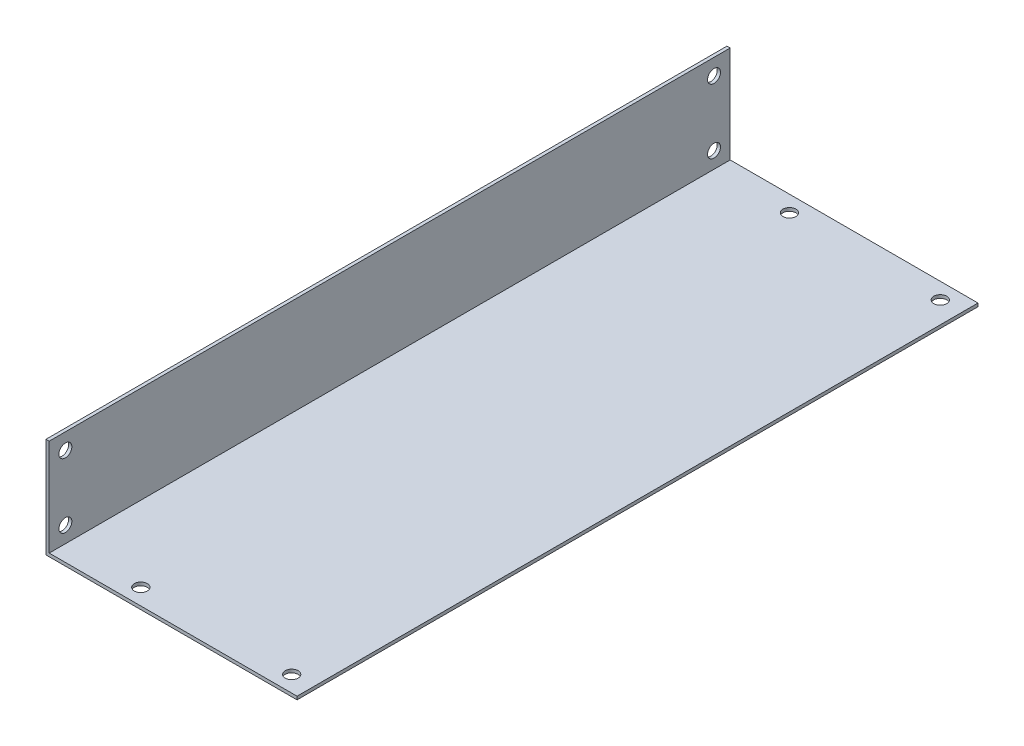
ISO-10303-21;
HEADER;
FILE_DESCRIPTION(('STEP AP214'),'2;1');
FILE_NAME('part.step','',(''),(''),'','','');
FILE_SCHEMA(('AUTOMOTIVE_DESIGN { 1 0 10303 214 1 1 1 1 }'));
ENDSEC;
DATA;
#1=APPLICATION_CONTEXT('core data for automotive mechanical design processes');
#2=APPLICATION_PROTOCOL_DEFINITION('international standard','automotive_design',2000,#1);
#3=PRODUCT_CONTEXT('',#1,'mechanical');
#4=PRODUCT('Part','Part','',(#3));
#5=PRODUCT_RELATED_PRODUCT_CATEGORY('part','',(#4));
#6=PRODUCT_DEFINITION_FORMATION('','',#4);
#7=PRODUCT_DEFINITION_CONTEXT('part definition',#1,'design');
#8=PRODUCT_DEFINITION('design','',#6,#7);
#9=PRODUCT_DEFINITION_SHAPE('','',#8);
#10=(LENGTH_UNIT() NAMED_UNIT(*) SI_UNIT(.MILLI.,.METRE.));
#11=(NAMED_UNIT(*) PLANE_ANGLE_UNIT() SI_UNIT($,.RADIAN.));
#12=(NAMED_UNIT(*) SI_UNIT($,.STERADIAN.) SOLID_ANGLE_UNIT());
#13=UNCERTAINTY_MEASURE_WITH_UNIT(LENGTH_MEASURE(1.E-05),#10,'distance_accuracy_value','');
#14=(GEOMETRIC_REPRESENTATION_CONTEXT(3) GLOBAL_UNCERTAINTY_ASSIGNED_CONTEXT((#13)) GLOBAL_UNIT_ASSIGNED_CONTEXT((#10,
#11,#12)) REPRESENTATION_CONTEXT('',''));
#15=CARTESIAN_POINT('',(0.,0.,0.));
#16=DIRECTION('',(0.,0.,1.));
#17=DIRECTION('',(1.,0.,0.));
#18=AXIS2_PLACEMENT_3D('',#15,#16,#17);
#19=CARTESIAN_POINT('',(1.5,0.,316.));
#20=DIRECTION('',(0.,-1.,0.));
#21=DIRECTION('',(0.,0.,-1.));
#22=AXIS2_PLACEMENT_3D('',#19,#20,#21);
#23=PLANE('',#22);
#24=DIRECTION('',(-1.,0.,0.));
#25=VECTOR('',#24,1.);
#26=CARTESIAN_POINT('',(1.5,0.,0.));
#27=LINE('',#26,#25);
#28=CARTESIAN_POINT('',(1.5,0.,0.));
#29=VERTEX_POINT('',#28);
#30=CARTESIAN_POINT('',(0.,0.,0.));
#31=VERTEX_POINT('',#30);
#32=EDGE_CURVE('E118',#29,#31,#27,.T.);
#33=ORIENTED_EDGE('',*,*,#32,.T.);
#34=DIRECTION('',(0.,0.,-1.));
#35=VECTOR('',#34,1.);
#36=CARTESIAN_POINT('',(0.,0.,316.));
#37=LINE('',#36,#35);
#38=CARTESIAN_POINT('',(0.,0.,316.));
#39=VERTEX_POINT('',#38);
#40=EDGE_CURVE('E11',#39,#31,#37,.T.);
#41=ORIENTED_EDGE('',*,*,#40,.F.);
#42=DIRECTION('',(-1.,0.,0.));
#43=VECTOR('',#42,1.);
#44=CARTESIAN_POINT('',(1.5,0.,316.));
#45=LINE('',#44,#43);
#46=CARTESIAN_POINT('',(1.5,0.,316.));
#47=VERTEX_POINT('',#46);
#48=EDGE_CURVE('E129',#47,#39,#45,.T.);
#49=ORIENTED_EDGE('',*,*,#48,.F.);
#50=DIRECTION('',(0.,0.,-1.));
#51=VECTOR('',#50,1.);
#52=CARTESIAN_POINT('',(1.5,0.,316.));
#53=LINE('',#52,#51);
#54=EDGE_CURVE('E114',#47,#29,#53,.T.);
#55=ORIENTED_EDGE('',*,*,#54,.T.);
#56=EDGE_LOOP('',(#33,#41,#49,#55));
#57=FACE_BOUND('',#56,.T.);
#58=ADVANCED_FACE('F34',(#57),#23,.F.);
#59=CARTESIAN_POINT('',(0.,0.,316.));
#60=DIRECTION('',(1.,0.,0.));
#61=DIRECTION('',(0.,1.,0.));
#62=AXIS2_PLACEMENT_3D('',#59,#60,#61);
#63=PLANE('',#62);
#64=CARTESIAN_POINT('',(0.,-37.5000000000001,7.50000000000017));
#65=DIRECTION('',(-1.,0.,0.));
#66=DIRECTION('',(0.,-1.,0.));
#67=AXIS2_PLACEMENT_3D('',#64,#65,#66);
#68=CIRCLE('',#67,2.99999999999999);
#69=CARTESIAN_POINT('',(0.,-40.5,7.50000000000017));
#70=VERTEX_POINT('',#69);
#71=EDGE_CURVE('E313',#70,#70,#68,.T.);
#72=ORIENTED_EDGE('',*,*,#71,.F.);
#73=EDGE_LOOP('',(#72));
#74=FACE_BOUND('',#73,.T.);
#75=CARTESIAN_POINT('',(0.,-7.50000000000006,7.49999999999995));
#76=DIRECTION('',(-1.,0.,0.));
#77=DIRECTION('',(0.,-1.,0.));
#78=AXIS2_PLACEMENT_3D('',#75,#76,#77);
#79=CIRCLE('',#78,3.);
#80=CARTESIAN_POINT('',(0.,-10.5000000000001,7.49999999999995));
#81=VERTEX_POINT('',#80);
#82=EDGE_CURVE('E312',#81,#81,#79,.T.);
#83=ORIENTED_EDGE('',*,*,#82,.F.);
#84=EDGE_LOOP('',(#83));
#85=FACE_BOUND('',#84,.T.);
#86=CARTESIAN_POINT('',(0.,-7.50000000000005,308.5));
#87=DIRECTION('',(-1.,0.,0.));
#88=DIRECTION('',(0.,1.,0.));
#89=AXIS2_PLACEMENT_3D('',#86,#87,#88);
#90=CIRCLE('',#89,2.99999999999999);
#91=CARTESIAN_POINT('',(0.,-4.50000000000006,308.5));
#92=VERTEX_POINT('',#91);
#93=EDGE_CURVE('E320',#92,#92,#90,.T.);
#94=ORIENTED_EDGE('',*,*,#93,.F.);
#95=EDGE_LOOP('',(#94));
#96=FACE_BOUND('',#95,.T.);
#97=CARTESIAN_POINT('',(0.,-37.5,308.5));
#98=DIRECTION('',(-1.,0.,0.));
#99=DIRECTION('',(0.,1.,0.));
#100=AXIS2_PLACEMENT_3D('',#97,#98,#99);
#101=CIRCLE('',#100,3.00000000000005);
#102=CARTESIAN_POINT('',(0.,-34.5,308.5));
#103=VERTEX_POINT('',#102);
#104=EDGE_CURVE('E299',#103,#103,#101,.T.);
#105=ORIENTED_EDGE('',*,*,#104,.F.);
#106=EDGE_LOOP('',(#105));
#107=FACE_BOUND('',#106,.T.);
#108=DIRECTION('',(0.,-1.,0.));
#109=VECTOR('',#108,1.);
#110=CARTESIAN_POINT('',(0.,0.,0.));
#111=LINE('',#110,#109);
#112=CARTESIAN_POINT('',(0.,-46.5,0.));
#113=VERTEX_POINT('',#112);
#114=EDGE_CURVE('E121',#31,#113,#111,.T.);
#115=ORIENTED_EDGE('',*,*,#114,.T.);
#116=DIRECTION('',(0.,0.,-1.));
#117=VECTOR('',#116,1.);
#118=CARTESIAN_POINT('',(0.,-46.5,316.));
#119=LINE('',#118,#117);
#120=CARTESIAN_POINT('',(0.,-46.5,316.));
#121=VERTEX_POINT('',#120);
#122=EDGE_CURVE('E42',#121,#113,#119,.T.);
#123=ORIENTED_EDGE('',*,*,#122,.F.);
#124=DIRECTION('',(0.,-1.,0.));
#125=VECTOR('',#124,1.);
#126=CARTESIAN_POINT('',(0.,0.,316.));
#127=LINE('',#126,#125);
#128=EDGE_CURVE('E87',#39,#121,#127,.T.);
#129=ORIENTED_EDGE('',*,*,#128,.F.);
#130=ORIENTED_EDGE('',*,*,#40,.T.);
#131=EDGE_LOOP('',(#115,#123,#129,#130));
#132=FACE_BOUND('',#131,.T.);
#133=ADVANCED_FACE('F157',(#74,#85,#96,#107,#132),#63,.F.);
#134=CARTESIAN_POINT('',(0.,-46.5,316.));
#135=DIRECTION('',(0.,1.,0.));
#136=DIRECTION('',(0.,0.,1.));
#137=AXIS2_PLACEMENT_3D('',#134,#135,#136);
#138=PLANE('',#137);
#139=CARTESIAN_POINT('',(36.5,-46.5,308.5));
#140=DIRECTION('',(0.,-1.,0.));
#141=DIRECTION('',(0.,0.,-1.));
#142=AXIS2_PLACEMENT_3D('',#139,#140,#141);
#143=CIRCLE('',#142,3.);
#144=CARTESIAN_POINT('',(36.5,-46.5,305.5));
#145=VERTEX_POINT('',#144);
#146=EDGE_CURVE('E336',#145,#145,#143,.T.);
#147=ORIENTED_EDGE('',*,*,#146,.F.);
#148=EDGE_LOOP('',(#147));
#149=FACE_BOUND('',#148,.T.);
#150=CARTESIAN_POINT('',(106.5,-46.5,7.50000000000001));
#151=DIRECTION('',(0.,-1.,0.));
#152=DIRECTION('',(0.,0.,1.));
#153=AXIS2_PLACEMENT_3D('',#150,#151,#152);
#154=CIRCLE('',#153,3.00000000000001);
#155=CARTESIAN_POINT('',(106.5,-46.5,4.5));
#156=VERTEX_POINT('',#155);
#157=EDGE_CURVE('E337',#156,#156,#154,.T.);
#158=ORIENTED_EDGE('',*,*,#157,.F.);
#159=EDGE_LOOP('',(#158));
#160=FACE_BOUND('',#159,.T.);
#161=CARTESIAN_POINT('',(36.5,-46.5,7.50000000000001));
#162=DIRECTION('',(0.,-1.,0.));
#163=DIRECTION('',(0.,0.,1.));
#164=AXIS2_PLACEMENT_3D('',#161,#162,#163);
#165=CIRCLE('',#164,3.);
#166=CARTESIAN_POINT('',(36.5,-46.5,4.50000000000001));
#167=VERTEX_POINT('',#166);
#168=EDGE_CURVE('E346',#167,#167,#165,.T.);
#169=ORIENTED_EDGE('',*,*,#168,.F.);
#170=EDGE_LOOP('',(#169));
#171=FACE_BOUND('',#170,.T.);
#172=CARTESIAN_POINT('',(106.5,-46.5,308.5));
#173=DIRECTION('',(0.,-1.,0.));
#174=DIRECTION('',(0.,0.,-1.));
#175=AXIS2_PLACEMENT_3D('',#172,#173,#174);
#176=CIRCLE('',#175,3.00000000000001);
#177=CARTESIAN_POINT('',(106.5,-46.5,305.5));
#178=VERTEX_POINT('',#177);
#179=EDGE_CURVE('E329',#178,#178,#176,.T.);
#180=ORIENTED_EDGE('',*,*,#179,.F.);
#181=EDGE_LOOP('',(#180));
#182=FACE_BOUND('',#181,.T.);
#183=DIRECTION('',(1.,0.,0.));
#184=VECTOR('',#183,1.);
#185=CARTESIAN_POINT('',(0.,-46.5,0.));
#186=LINE('',#185,#184);
#187=CARTESIAN_POINT('',(116.5,-46.5,0.));
#188=VERTEX_POINT('',#187);
#189=EDGE_CURVE('E124',#113,#188,#186,.T.);
#190=ORIENTED_EDGE('',*,*,#189,.T.);
#191=DIRECTION('',(0.,0.,-1.));
#192=VECTOR('',#191,1.);
#193=CARTESIAN_POINT('',(116.5,-46.5,316.));
#194=LINE('',#193,#192);
#195=CARTESIAN_POINT('',(116.5,-46.5,316.));
#196=VERTEX_POINT('',#195);
#197=EDGE_CURVE('E109',#196,#188,#194,.T.);
#198=ORIENTED_EDGE('',*,*,#197,.F.);
#199=DIRECTION('',(1.,0.,0.));
#200=VECTOR('',#199,1.);
#201=CARTESIAN_POINT('',(0.,-46.5,316.));
#202=LINE('',#201,#200);
#203=EDGE_CURVE('E100',#121,#196,#202,.T.);
#204=ORIENTED_EDGE('',*,*,#203,.F.);
#205=ORIENTED_EDGE('',*,*,#122,.T.);
#206=EDGE_LOOP('',(#190,#198,#204,#205));
#207=FACE_BOUND('',#206,.T.);
#208=ADVANCED_FACE('F135',(#149,#160,#171,#182,#207),#138,.F.);
#209=CARTESIAN_POINT('',(116.5,-46.5,316.));
#210=DIRECTION('',(-1.,0.,0.));
#211=DIRECTION('',(0.,0.,1.));
#212=AXIS2_PLACEMENT_3D('',#209,#210,#211);
#213=PLANE('',#212);
#214=DIRECTION('',(0.,1.,0.));
#215=VECTOR('',#214,1.);
#216=CARTESIAN_POINT('',(116.5,-46.5,0.));
#217=LINE('',#216,#215);
#218=CARTESIAN_POINT('',(116.5,-45.,0.));
#219=VERTEX_POINT('',#218);
#220=EDGE_CURVE('E108',#188,#219,#217,.T.);
#221=ORIENTED_EDGE('',*,*,#220,.T.);
#222=DIRECTION('',(0.,0.,-1.));
#223=VECTOR('',#222,1.);
#224=CARTESIAN_POINT('',(116.5,-45.,316.));
#225=LINE('',#224,#223);
#226=CARTESIAN_POINT('',(116.5,-45.,316.));
#227=VERTEX_POINT('',#226);
#228=EDGE_CURVE('E105',#227,#219,#225,.T.);
#229=ORIENTED_EDGE('',*,*,#228,.F.);
#230=DIRECTION('',(0.,1.,0.));
#231=VECTOR('',#230,1.);
#232=CARTESIAN_POINT('',(116.5,-46.5,316.));
#233=LINE('',#232,#231);
#234=EDGE_CURVE('E94',#196,#227,#233,.T.);
#235=ORIENTED_EDGE('',*,*,#234,.F.);
#236=ORIENTED_EDGE('',*,*,#197,.T.);
#237=EDGE_LOOP('',(#221,#229,#235,#236));
#238=FACE_BOUND('',#237,.T.);
#239=ADVANCED_FACE('F106',(#238),#213,.F.);
#240=CARTESIAN_POINT('',(116.5,-45.,316.));
#241=DIRECTION('',(0.,-1.,0.));
#242=DIRECTION('',(1.,0.,0.));
#243=AXIS2_PLACEMENT_3D('',#240,#241,#242);
#244=PLANE('',#243);
#245=CARTESIAN_POINT('',(36.5,-45.,308.5));
#246=DIRECTION('',(0.,-1.,0.));
#247=DIRECTION('',(1.,0.,0.));
#248=AXIS2_PLACEMENT_3D('',#245,#246,#247);
#249=CIRCLE('',#248,3.);
#250=CARTESIAN_POINT('',(36.5,-45.,305.5));
#251=VERTEX_POINT('',#250);
#252=EDGE_CURVE('E332',#251,#251,#249,.F.);
#253=ORIENTED_EDGE('',*,*,#252,.F.);
#254=EDGE_LOOP('',(#253));
#255=FACE_BOUND('',#254,.T.);
#256=CARTESIAN_POINT('',(106.5,-45.,7.50000000000001));
#257=DIRECTION('',(0.,-1.,0.));
#258=DIRECTION('',(1.,0.,0.));
#259=AXIS2_PLACEMENT_3D('',#256,#257,#258);
#260=CIRCLE('',#259,3.00000000000001);
#261=CARTESIAN_POINT('',(106.5,-45.,4.5));
#262=VERTEX_POINT('',#261);
#263=EDGE_CURVE('E333',#262,#262,#260,.F.);
#264=ORIENTED_EDGE('',*,*,#263,.F.);
#265=EDGE_LOOP('',(#264));
#266=FACE_BOUND('',#265,.T.);
#267=CARTESIAN_POINT('',(36.5,-45.,7.50000000000001));
#268=DIRECTION('',(0.,-1.,0.));
#269=DIRECTION('',(1.,0.,0.));
#270=AXIS2_PLACEMENT_3D('',#267,#268,#269);
#271=CIRCLE('',#270,3.);
#272=CARTESIAN_POINT('',(36.5,-45.,4.50000000000001));
#273=VERTEX_POINT('',#272);
#274=EDGE_CURVE('E340',#273,#273,#271,.F.);
#275=ORIENTED_EDGE('',*,*,#274,.F.);
#276=EDGE_LOOP('',(#275));
#277=FACE_BOUND('',#276,.T.);
#278=CARTESIAN_POINT('',(106.5,-45.,308.5));
#279=DIRECTION('',(0.,-1.,0.));
#280=DIRECTION('',(1.,0.,0.));
#281=AXIS2_PLACEMENT_3D('',#278,#279,#280);
#282=CIRCLE('',#281,3.00000000000001);
#283=CARTESIAN_POINT('',(106.5,-45.,305.5));
#284=VERTEX_POINT('',#283);
#285=EDGE_CURVE('E316',#284,#284,#282,.F.);
#286=ORIENTED_EDGE('',*,*,#285,.F.);
#287=EDGE_LOOP('',(#286));
#288=FACE_BOUND('',#287,.T.);
#289=DIRECTION('',(-1.,0.,0.));
#290=VECTOR('',#289,1.);
#291=CARTESIAN_POINT('',(116.5,-45.,0.));
#292=LINE('',#291,#290);
#293=CARTESIAN_POINT('',(1.5,-45.,0.));
#294=VERTEX_POINT('',#293);
#295=EDGE_CURVE('E73',#219,#294,#292,.T.);
#296=ORIENTED_EDGE('',*,*,#295,.T.);
#297=DIRECTION('',(0.,0.,-1.));
#298=VECTOR('',#297,1.);
#299=CARTESIAN_POINT('',(1.5,-45.,316.));
#300=LINE('',#299,#298);
#301=CARTESIAN_POINT('',(1.5,-45.,316.));
#302=VERTEX_POINT('',#301);
#303=EDGE_CURVE('E110',#302,#294,#300,.T.);
#304=ORIENTED_EDGE('',*,*,#303,.F.);
#305=DIRECTION('',(-1.,0.,0.));
#306=VECTOR('',#305,1.);
#307=CARTESIAN_POINT('',(116.5,-45.,316.));
#308=LINE('',#307,#306);
#309=EDGE_CURVE('E98',#227,#302,#308,.T.);
#310=ORIENTED_EDGE('',*,*,#309,.F.);
#311=ORIENTED_EDGE('',*,*,#228,.T.);
#312=EDGE_LOOP('',(#296,#304,#310,#311));
#313=FACE_BOUND('',#312,.T.);
#314=ADVANCED_FACE('F112',(#255,#266,#277,#288,#313),#244,.F.);
#315=CARTESIAN_POINT('',(1.5,-45.,316.));
#316=DIRECTION('',(-1.,0.,0.));
#317=DIRECTION('',(0.,-1.,0.));
#318=AXIS2_PLACEMENT_3D('',#315,#316,#317);
#319=PLANE('',#318);
#320=CARTESIAN_POINT('',(1.5,-37.5000000000001,7.50000000000017));
#321=DIRECTION('',(-1.,0.,0.));
#322=DIRECTION('',(0.,-1.,0.));
#323=AXIS2_PLACEMENT_3D('',#320,#321,#322);
#324=CIRCLE('',#323,2.99999999999999);
#325=CARTESIAN_POINT('',(1.5,-40.5,7.50000000000017));
#326=VERTEX_POINT('',#325);
#327=EDGE_CURVE('E309',#326,#326,#324,.F.);
#328=ORIENTED_EDGE('',*,*,#327,.F.);
#329=EDGE_LOOP('',(#328));
#330=FACE_BOUND('',#329,.T.);
#331=CARTESIAN_POINT('',(1.5,-7.50000000000006,7.49999999999995));
#332=DIRECTION('',(-1.,0.,0.));
#333=DIRECTION('',(0.,-1.,0.));
#334=AXIS2_PLACEMENT_3D('',#331,#332,#333);
#335=CIRCLE('',#334,3.);
#336=CARTESIAN_POINT('',(1.5,-10.5000000000001,7.49999999999995));
#337=VERTEX_POINT('',#336);
#338=EDGE_CURVE('E317',#337,#337,#335,.F.);
#339=ORIENTED_EDGE('',*,*,#338,.F.);
#340=EDGE_LOOP('',(#339));
#341=FACE_BOUND('',#340,.T.);
#342=CARTESIAN_POINT('',(1.5,-7.50000000000005,308.5));
#343=DIRECTION('',(-1.,0.,0.));
#344=DIRECTION('',(0.,-1.,0.));
#345=AXIS2_PLACEMENT_3D('',#342,#343,#344);
#346=CIRCLE('',#345,2.99999999999999);
#347=CARTESIAN_POINT('',(1.5,-10.5,308.5));
#348=VERTEX_POINT('',#347);
#349=EDGE_CURVE('E304',#348,#348,#346,.F.);
#350=ORIENTED_EDGE('',*,*,#349,.F.);
#351=EDGE_LOOP('',(#350));
#352=FACE_BOUND('',#351,.T.);
#353=CARTESIAN_POINT('',(1.5,-37.5,308.5));
#354=DIRECTION('',(-1.,0.,0.));
#355=DIRECTION('',(0.,-1.,0.));
#356=AXIS2_PLACEMENT_3D('',#353,#354,#355);
#357=CIRCLE('',#356,3.00000000000005);
#358=CARTESIAN_POINT('',(1.5,-40.5000000000001,308.5));
#359=VERTEX_POINT('',#358);
#360=EDGE_CURVE('E122',#359,#359,#357,.F.);
#361=ORIENTED_EDGE('',*,*,#360,.F.);
#362=EDGE_LOOP('',(#361));
#363=FACE_BOUND('',#362,.T.);
#364=DIRECTION('',(0.,1.,0.));
#365=VECTOR('',#364,1.);
#366=CARTESIAN_POINT('',(1.5,-45.,0.));
#367=LINE('',#366,#365);
#368=EDGE_CURVE('E79',#294,#29,#367,.T.);
#369=ORIENTED_EDGE('',*,*,#368,.T.);
#370=ORIENTED_EDGE('',*,*,#54,.F.);
#371=DIRECTION('',(0.,1.,0.));
#372=VECTOR('',#371,1.);
#373=CARTESIAN_POINT('',(1.5,-45.,316.));
#374=LINE('',#373,#372);
#375=EDGE_CURVE('E50',#302,#47,#374,.T.);
#376=ORIENTED_EDGE('',*,*,#375,.F.);
#377=ORIENTED_EDGE('',*,*,#303,.T.);
#378=EDGE_LOOP('',(#369,#370,#376,#377));
#379=FACE_BOUND('',#378,.T.);
#380=ADVANCED_FACE('F142',(#330,#341,#352,#363,#379),#319,.F.);
#381=CARTESIAN_POINT('',(0.,0.,316.));
#382=DIRECTION('',(0.,0.,1.));
#383=DIRECTION('',(1.,0.,0.));
#384=AXIS2_PLACEMENT_3D('',#381,#382,#383);
#385=PLANE('',#384);
#386=ORIENTED_EDGE('',*,*,#48,.T.);
#387=ORIENTED_EDGE('',*,*,#128,.T.);
#388=ORIENTED_EDGE('',*,*,#203,.T.);
#389=ORIENTED_EDGE('',*,*,#234,.T.);
#390=ORIENTED_EDGE('',*,*,#309,.T.);
#391=ORIENTED_EDGE('',*,*,#375,.T.);
#392=EDGE_LOOP('',(#386,#387,#388,#389,#390,#391));
#393=FACE_BOUND('',#392,.T.);
#394=ADVANCED_FACE('F96',(#393),#385,.T.);
#395=CARTESIAN_POINT('',(0.,0.,0.));
#396=DIRECTION('',(0.,0.,1.));
#397=DIRECTION('',(1.,0.,0.));
#398=AXIS2_PLACEMENT_3D('',#395,#396,#397);
#399=PLANE('',#398);
#400=ORIENTED_EDGE('',*,*,#32,.F.);
#401=ORIENTED_EDGE('',*,*,#368,.F.);
#402=ORIENTED_EDGE('',*,*,#295,.F.);
#403=ORIENTED_EDGE('',*,*,#220,.F.);
#404=ORIENTED_EDGE('',*,*,#189,.F.);
#405=ORIENTED_EDGE('',*,*,#114,.F.);
#406=EDGE_LOOP('',(#400,#401,#402,#403,#404,#405));
#407=FACE_BOUND('',#406,.T.);
#408=ADVANCED_FACE('F138',(#407),#399,.F.);
#409=CARTESIAN_POINT('',(116.501,-37.5,308.5));
#410=DIRECTION('',(-1.,0.,0.));
#411=DIRECTION('',(0.,-1.,0.));
#412=AXIS2_PLACEMENT_3D('',#409,#410,#411);
#413=CYLINDRICAL_SURFACE('',#412,3.00000000000005);
#414=ORIENTED_EDGE('',*,*,#104,.T.);
#415=EDGE_LOOP('',(#414));
#416=FACE_BOUND('',#415,.T.);
#417=ORIENTED_EDGE('',*,*,#360,.T.);
#418=EDGE_LOOP('',(#417));
#419=FACE_BOUND('',#418,.T.);
#420=ADVANCED_FACE('F238',(#416,#419),#413,.F.);
#421=CARTESIAN_POINT('',(116.501,-7.50000000000004,308.5));
#422=DIRECTION('',(-1.,0.,0.));
#423=DIRECTION('',(0.,-1.,0.));
#424=AXIS2_PLACEMENT_3D('',#421,#422,#423);
#425=CYLINDRICAL_SURFACE('',#424,2.99999999999999);
#426=ORIENTED_EDGE('',*,*,#93,.T.);
#427=EDGE_LOOP('',(#426));
#428=FACE_BOUND('',#427,.T.);
#429=ORIENTED_EDGE('',*,*,#349,.T.);
#430=EDGE_LOOP('',(#429));
#431=FACE_BOUND('',#430,.T.);
#432=ADVANCED_FACE('F234',(#428,#431),#425,.F.);
#433=CARTESIAN_POINT('',(116.501,-7.50000000000004,7.49999999999995));
#434=DIRECTION('',(-1.,0.,0.));
#435=DIRECTION('',(0.,-1.,0.));
#436=AXIS2_PLACEMENT_3D('',#433,#434,#435);
#437=CYLINDRICAL_SURFACE('',#436,3.);
#438=ORIENTED_EDGE('',*,*,#82,.T.);
#439=EDGE_LOOP('',(#438));
#440=FACE_BOUND('',#439,.T.);
#441=ORIENTED_EDGE('',*,*,#338,.T.);
#442=EDGE_LOOP('',(#441));
#443=FACE_BOUND('',#442,.T.);
#444=ADVANCED_FACE('F237',(#440,#443),#437,.F.);
#445=CARTESIAN_POINT('',(116.501,-37.5,7.50000000000017));
#446=DIRECTION('',(-1.,0.,0.));
#447=DIRECTION('',(0.,-1.,0.));
#448=AXIS2_PLACEMENT_3D('',#445,#446,#447);
#449=CYLINDRICAL_SURFACE('',#448,2.99999999999999);
#450=ORIENTED_EDGE('',*,*,#71,.T.);
#451=EDGE_LOOP('',(#450));
#452=FACE_BOUND('',#451,.T.);
#453=ORIENTED_EDGE('',*,*,#327,.T.);
#454=EDGE_LOOP('',(#453));
#455=FACE_BOUND('',#454,.T.);
#456=ADVANCED_FACE('F195',(#452,#455),#449,.F.);
#457=CARTESIAN_POINT('',(106.5,0.001000000000001,308.5));
#458=DIRECTION('',(0.,-1.,0.));
#459=DIRECTION('',(0.,0.,-1.));
#460=AXIS2_PLACEMENT_3D('',#457,#458,#459);
#461=CYLINDRICAL_SURFACE('',#460,3.00000000000001);
#462=CARTESIAN_POINT('',(106.5,-46.5,305.5));
#463=CARTESIAN_POINT('',(106.5,-46.484375,305.5));
#464=CARTESIAN_POINT('',(106.5,-46.46875,305.5));
#465=CARTESIAN_POINT('',(106.5,-46.4375,305.5));
#466=CARTESIAN_POINT('',(106.5,-46.421875,305.5));
#467=CARTESIAN_POINT('',(106.5,-46.390625,305.5));
#468=CARTESIAN_POINT('',(106.5,-46.375,305.5));
#469=CARTESIAN_POINT('',(106.5,-46.34375,305.5));
#470=CARTESIAN_POINT('',(106.5,-46.328125,305.5));
#471=CARTESIAN_POINT('',(106.5,-46.296875,305.5));
#472=CARTESIAN_POINT('',(106.5,-46.28125,305.5));
#473=CARTESIAN_POINT('',(106.5,-46.25,305.5));
#474=CARTESIAN_POINT('',(106.5,-46.234375,305.5));
#475=CARTESIAN_POINT('',(106.5,-46.203125,305.5));
#476=CARTESIAN_POINT('',(106.5,-46.1875,305.5));
#477=CARTESIAN_POINT('',(106.5,-46.15625,305.5));
#478=CARTESIAN_POINT('',(106.5,-46.140625,305.5));
#479=CARTESIAN_POINT('',(106.5,-46.109375,305.5));
#480=CARTESIAN_POINT('',(106.5,-46.09375,305.5));
#481=CARTESIAN_POINT('',(106.5,-46.0625,305.5));
#482=CARTESIAN_POINT('',(106.5,-46.046875,305.5));
#483=CARTESIAN_POINT('',(106.5,-46.015625,305.5));
#484=CARTESIAN_POINT('',(106.5,-46.,305.5));
#485=CARTESIAN_POINT('',(106.5,-45.96875,305.5));
#486=CARTESIAN_POINT('',(106.5,-45.953125,305.5));
#487=CARTESIAN_POINT('',(106.5,-45.921875,305.5));
#488=CARTESIAN_POINT('',(106.5,-45.90625,305.5));
#489=CARTESIAN_POINT('',(106.5,-45.875,305.5));
#490=CARTESIAN_POINT('',(106.5,-45.859375,305.5));
#491=CARTESIAN_POINT('',(106.5,-45.828125,305.5));
#492=CARTESIAN_POINT('',(106.5,-45.8125,305.5));
#493=CARTESIAN_POINT('',(106.5,-45.78125,305.5));
#494=CARTESIAN_POINT('',(106.5,-45.765625,305.5));
#495=CARTESIAN_POINT('',(106.5,-45.734375,305.5));
#496=CARTESIAN_POINT('',(106.5,-45.71875,305.5));
#497=CARTESIAN_POINT('',(106.5,-45.6875,305.5));
#498=CARTESIAN_POINT('',(106.5,-45.671875,305.5));
#499=CARTESIAN_POINT('',(106.5,-45.640625,305.5));
#500=CARTESIAN_POINT('',(106.5,-45.625,305.5));
#501=CARTESIAN_POINT('',(106.5,-45.59375,305.5));
#502=CARTESIAN_POINT('',(106.5,-45.578125,305.5));
#503=CARTESIAN_POINT('',(106.5,-45.546875,305.5));
#504=CARTESIAN_POINT('',(106.5,-45.53125,305.5));
#505=CARTESIAN_POINT('',(106.5,-45.5,305.5));
#506=CARTESIAN_POINT('',(106.5,-45.484375,305.5));
#507=CARTESIAN_POINT('',(106.5,-45.453125,305.5));
#508=CARTESIAN_POINT('',(106.5,-45.4375,305.5));
#509=CARTESIAN_POINT('',(106.5,-45.40625,305.5));
#510=CARTESIAN_POINT('',(106.5,-45.390625,305.5));
#511=CARTESIAN_POINT('',(106.5,-45.359375,305.5));
#512=CARTESIAN_POINT('',(106.5,-45.34375,305.5));
#513=CARTESIAN_POINT('',(106.5,-45.3125,305.5));
#514=CARTESIAN_POINT('',(106.5,-45.296875,305.5));
#515=CARTESIAN_POINT('',(106.5,-45.265625,305.5));
#516=CARTESIAN_POINT('',(106.5,-45.25,305.5));
#517=CARTESIAN_POINT('',(106.5,-45.21875,305.5));
#518=CARTESIAN_POINT('',(106.5,-45.203125,305.5));
#519=CARTESIAN_POINT('',(106.5,-45.171875,305.5));
#520=CARTESIAN_POINT('',(106.5,-45.15625,305.5));
#521=CARTESIAN_POINT('',(106.5,-45.125,305.5));
#522=CARTESIAN_POINT('',(106.5,-45.109375,305.5));
#523=CARTESIAN_POINT('',(106.5,-45.078125,305.5));
#524=CARTESIAN_POINT('',(106.5,-45.0625,305.5));
#525=CARTESIAN_POINT('',(106.5,-45.03125,305.5));
#526=CARTESIAN_POINT('',(106.5,-45.015625,305.5));
#527=CARTESIAN_POINT('',(106.5,-45.,305.5));
#528=B_SPLINE_CURVE_WITH_KNOTS('',3,(#462,#463,#464,#465,#466,#467,#468,#469,#470,#471,#472,
#473,#474,#475,#476,#477,#478,#479,#480,#481,#482,#483,#484,#485,#486,#487,#488,#489,#490,#491,
#492,#493,#494,#495,#496,#497,#498,#499,#500,#501,#502,#503,#504,#505,#506,#507,#508,#509,#510,
#511,#512,#513,#514,#515,#516,#517,#518,#519,#520,#521,#522,#523,#524,#525,#526,#527),
.UNSPECIFIED.,.F.,.F.,(4,2,2,2,2,2,2,2,2,2,2,2,2,2,2,2,2,2,2,2,2,2,2,2,2,2,2,2,2,2,2,2,4),(0.,
0.0468750000000018,0.0937500000000036,0.140624999999998,0.1875,0.234375000000002,
0.281249999999997,0.328124999999999,0.375,0.421875000000002,0.468750000000004,0.515624999999999,
0.5625,0.609375000000002,0.656249999999997,0.703124999999999,0.750000000000001,
0.796875000000002,0.843750000000004,0.890624999999999,0.937500000000001,0.984375000000003,
1.03125,1.078125,1.125,1.171875,1.21875,1.265625,1.3125,1.359375,1.40625,1.453125,1.5),.UNSPECIFIED.);
#529=EDGE_CURVE('BSEAM189',#178,#284,#528,.T.);
#530=ORIENTED_EDGE('',*,*,#179,.T.);
#531=ORIENTED_EDGE('',*,*,#285,.T.);
#532=ORIENTED_EDGE('',*,*,#529,.T.);
#533=ORIENTED_EDGE('',*,*,#529,.F.);
#534=EDGE_LOOP('',(#530,#532,#531,#533));
#535=FACE_BOUND('',#534,.T.);
#536=ADVANCED_FACE('F189',(#535),#461,.F.);
#537=CARTESIAN_POINT('',(36.5,0.001000000000001,7.50000000000001));
#538=DIRECTION('',(0.,-1.,0.));
#539=DIRECTION('',(0.,0.,-1.));
#540=AXIS2_PLACEMENT_3D('',#537,#538,#539);
#541=CYLINDRICAL_SURFACE('',#540,3.);
#542=CARTESIAN_POINT('',(36.5,-46.5,4.50000000000001));
#543=CARTESIAN_POINT('',(36.5,-46.484375,4.50000000000001));
#544=CARTESIAN_POINT('',(36.5,-46.46875,4.50000000000001));
#545=CARTESIAN_POINT('',(36.5,-46.4375,4.50000000000001));
#546=CARTESIAN_POINT('',(36.5,-46.421875,4.50000000000001));
#547=CARTESIAN_POINT('',(36.5,-46.390625,4.50000000000001));
#548=CARTESIAN_POINT('',(36.5,-46.375,4.50000000000001));
#549=CARTESIAN_POINT('',(36.5,-46.34375,4.50000000000001));
#550=CARTESIAN_POINT('',(36.5,-46.328125,4.50000000000001));
#551=CARTESIAN_POINT('',(36.5,-46.296875,4.50000000000001));
#552=CARTESIAN_POINT('',(36.5,-46.28125,4.50000000000001));
#553=CARTESIAN_POINT('',(36.5,-46.25,4.50000000000001));
#554=CARTESIAN_POINT('',(36.5,-46.234375,4.50000000000001));
#555=CARTESIAN_POINT('',(36.5,-46.203125,4.50000000000001));
#556=CARTESIAN_POINT('',(36.5,-46.1875,4.50000000000001));
#557=CARTESIAN_POINT('',(36.5,-46.15625,4.50000000000001));
#558=CARTESIAN_POINT('',(36.5,-46.140625,4.50000000000001));
#559=CARTESIAN_POINT('',(36.5,-46.109375,4.50000000000001));
#560=CARTESIAN_POINT('',(36.5,-46.09375,4.50000000000001));
#561=CARTESIAN_POINT('',(36.5,-46.0625,4.50000000000001));
#562=CARTESIAN_POINT('',(36.5,-46.046875,4.50000000000001));
#563=CARTESIAN_POINT('',(36.5,-46.015625,4.50000000000001));
#564=CARTESIAN_POINT('',(36.5,-46.,4.50000000000001));
#565=CARTESIAN_POINT('',(36.5,-45.96875,4.50000000000001));
#566=CARTESIAN_POINT('',(36.5,-45.953125,4.50000000000001));
#567=CARTESIAN_POINT('',(36.5,-45.921875,4.50000000000001));
#568=CARTESIAN_POINT('',(36.5,-45.90625,4.50000000000001));
#569=CARTESIAN_POINT('',(36.5,-45.875,4.50000000000001));
#570=CARTESIAN_POINT('',(36.5,-45.859375,4.50000000000001));
#571=CARTESIAN_POINT('',(36.5,-45.828125,4.50000000000001));
#572=CARTESIAN_POINT('',(36.5,-45.8125,4.50000000000001));
#573=CARTESIAN_POINT('',(36.5,-45.78125,4.50000000000001));
#574=CARTESIAN_POINT('',(36.5,-45.765625,4.50000000000001));
#575=CARTESIAN_POINT('',(36.5,-45.734375,4.50000000000001));
#576=CARTESIAN_POINT('',(36.5,-45.71875,4.50000000000001));
#577=CARTESIAN_POINT('',(36.5,-45.6875,4.50000000000001));
#578=CARTESIAN_POINT('',(36.5,-45.671875,4.50000000000001));
#579=CARTESIAN_POINT('',(36.5,-45.640625,4.50000000000001));
#580=CARTESIAN_POINT('',(36.5,-45.625,4.50000000000001));
#581=CARTESIAN_POINT('',(36.5,-45.59375,4.50000000000001));
#582=CARTESIAN_POINT('',(36.5,-45.578125,4.50000000000001));
#583=CARTESIAN_POINT('',(36.5,-45.546875,4.50000000000001));
#584=CARTESIAN_POINT('',(36.5,-45.53125,4.50000000000001));
#585=CARTESIAN_POINT('',(36.5,-45.5,4.50000000000001));
#586=CARTESIAN_POINT('',(36.5,-45.484375,4.50000000000001));
#587=CARTESIAN_POINT('',(36.5,-45.453125,4.50000000000001));
#588=CARTESIAN_POINT('',(36.5,-45.4375,4.50000000000001));
#589=CARTESIAN_POINT('',(36.5,-45.40625,4.50000000000001));
#590=CARTESIAN_POINT('',(36.5,-45.390625,4.50000000000001));
#591=CARTESIAN_POINT('',(36.5,-45.359375,4.50000000000001));
#592=CARTESIAN_POINT('',(36.5,-45.34375,4.50000000000001));
#593=CARTESIAN_POINT('',(36.5,-45.3125,4.50000000000001));
#594=CARTESIAN_POINT('',(36.5,-45.296875,4.50000000000001));
#595=CARTESIAN_POINT('',(36.5,-45.265625,4.50000000000001));
#596=CARTESIAN_POINT('',(36.5,-45.25,4.50000000000001));
#597=CARTESIAN_POINT('',(36.5,-45.21875,4.50000000000001));
#598=CARTESIAN_POINT('',(36.5,-45.203125,4.50000000000001));
#599=CARTESIAN_POINT('',(36.5,-45.171875,4.50000000000001));
#600=CARTESIAN_POINT('',(36.5,-45.15625,4.50000000000001));
#601=CARTESIAN_POINT('',(36.5,-45.125,4.50000000000001));
#602=CARTESIAN_POINT('',(36.5,-45.109375,4.50000000000001));
#603=CARTESIAN_POINT('',(36.5,-45.078125,4.50000000000001));
#604=CARTESIAN_POINT('',(36.5,-45.0625,4.50000000000001));
#605=CARTESIAN_POINT('',(36.5,-45.03125,4.50000000000001));
#606=CARTESIAN_POINT('',(36.5,-45.015625,4.50000000000001));
#607=CARTESIAN_POINT('',(36.5,-45.,4.50000000000001));
#608=B_SPLINE_CURVE_WITH_KNOTS('',3,(#542,#543,#544,#545,#546,#547,#548,#549,#550,#551,#552,
#553,#554,#555,#556,#557,#558,#559,#560,#561,#562,#563,#564,#565,#566,#567,#568,#569,#570,#571,
#572,#573,#574,#575,#576,#577,#578,#579,#580,#581,#582,#583,#584,#585,#586,#587,#588,#589,#590,
#591,#592,#593,#594,#595,#596,#597,#598,#599,#600,#601,#602,#603,#604,#605,#606,#607),
.UNSPECIFIED.,.F.,.F.,(4,2,2,2,2,2,2,2,2,2,2,2,2,2,2,2,2,2,2,2,2,2,2,2,2,2,2,2,2,2,2,2,4),(0.,
0.0468750000000018,0.0937499999999966,0.140624999999998,0.1875,0.234374999999995,
0.281249999999997,0.328124999999999,0.375,0.421874999999995,0.468749999999997,0.515624999999999,
0.562499999999994,0.609374999999995,0.656249999999997,0.703124999999992,0.749999999999994,
0.796874999999996,0.84374999999999,0.890624999999992,0.937499999999994,0.984374999999989,
1.03124999999999,1.07812499999999,1.12499999999999,1.17187499999999,1.21874999999999,
1.26562499999999,1.31249999999999,1.35937499999999,1.40624999999999,1.45312499999999,
1.49999999999999),.UNSPECIFIED.);
#609=EDGE_CURVE('BSEAM194',#167,#273,#608,.T.);
#610=ORIENTED_EDGE('',*,*,#168,.T.);
#611=ORIENTED_EDGE('',*,*,#274,.T.);
#612=ORIENTED_EDGE('',*,*,#609,.T.);
#613=ORIENTED_EDGE('',*,*,#609,.F.);
#614=EDGE_LOOP('',(#610,#612,#611,#613));
#615=FACE_BOUND('',#614,.T.);
#616=ADVANCED_FACE('F194',(#615),#541,.F.);
#617=CARTESIAN_POINT('',(106.5,0.001000000000001,7.50000000000001));
#618=DIRECTION('',(0.,-1.,0.));
#619=DIRECTION('',(0.,0.,-1.));
#620=AXIS2_PLACEMENT_3D('',#617,#618,#619);
#621=CYLINDRICAL_SURFACE('',#620,3.00000000000001);
#622=CARTESIAN_POINT('',(106.5,-46.5,4.5));
#623=CARTESIAN_POINT('',(106.5,-46.484375,4.5));
#624=CARTESIAN_POINT('',(106.5,-46.46875,4.5));
#625=CARTESIAN_POINT('',(106.5,-46.4375,4.5));
#626=CARTESIAN_POINT('',(106.5,-46.421875,4.5));
#627=CARTESIAN_POINT('',(106.5,-46.390625,4.5));
#628=CARTESIAN_POINT('',(106.5,-46.375,4.5));
#629=CARTESIAN_POINT('',(106.5,-46.34375,4.5));
#630=CARTESIAN_POINT('',(106.5,-46.328125,4.5));
#631=CARTESIAN_POINT('',(106.5,-46.296875,4.5));
#632=CARTESIAN_POINT('',(106.5,-46.28125,4.5));
#633=CARTESIAN_POINT('',(106.5,-46.25,4.5));
#634=CARTESIAN_POINT('',(106.5,-46.234375,4.5));
#635=CARTESIAN_POINT('',(106.5,-46.203125,4.5));
#636=CARTESIAN_POINT('',(106.5,-46.1875,4.5));
#637=CARTESIAN_POINT('',(106.5,-46.15625,4.5));
#638=CARTESIAN_POINT('',(106.5,-46.140625,4.5));
#639=CARTESIAN_POINT('',(106.5,-46.109375,4.5));
#640=CARTESIAN_POINT('',(106.5,-46.09375,4.5));
#641=CARTESIAN_POINT('',(106.5,-46.0625,4.5));
#642=CARTESIAN_POINT('',(106.5,-46.046875,4.5));
#643=CARTESIAN_POINT('',(106.5,-46.015625,4.5));
#644=CARTESIAN_POINT('',(106.5,-46.,4.5));
#645=CARTESIAN_POINT('',(106.5,-45.96875,4.5));
#646=CARTESIAN_POINT('',(106.5,-45.953125,4.5));
#647=CARTESIAN_POINT('',(106.5,-45.921875,4.5));
#648=CARTESIAN_POINT('',(106.5,-45.90625,4.5));
#649=CARTESIAN_POINT('',(106.5,-45.875,4.5));
#650=CARTESIAN_POINT('',(106.5,-45.859375,4.5));
#651=CARTESIAN_POINT('',(106.5,-45.828125,4.5));
#652=CARTESIAN_POINT('',(106.5,-45.8125,4.5));
#653=CARTESIAN_POINT('',(106.5,-45.78125,4.5));
#654=CARTESIAN_POINT('',(106.5,-45.765625,4.5));
#655=CARTESIAN_POINT('',(106.5,-45.734375,4.5));
#656=CARTESIAN_POINT('',(106.5,-45.71875,4.5));
#657=CARTESIAN_POINT('',(106.5,-45.6875,4.5));
#658=CARTESIAN_POINT('',(106.5,-45.671875,4.5));
#659=CARTESIAN_POINT('',(106.5,-45.640625,4.5));
#660=CARTESIAN_POINT('',(106.5,-45.625,4.5));
#661=CARTESIAN_POINT('',(106.5,-45.59375,4.5));
#662=CARTESIAN_POINT('',(106.5,-45.578125,4.5));
#663=CARTESIAN_POINT('',(106.5,-45.546875,4.5));
#664=CARTESIAN_POINT('',(106.5,-45.53125,4.5));
#665=CARTESIAN_POINT('',(106.5,-45.5,4.5));
#666=CARTESIAN_POINT('',(106.5,-45.484375,4.5));
#667=CARTESIAN_POINT('',(106.5,-45.453125,4.5));
#668=CARTESIAN_POINT('',(106.5,-45.4375,4.5));
#669=CARTESIAN_POINT('',(106.5,-45.40625,4.5));
#670=CARTESIAN_POINT('',(106.5,-45.390625,4.5));
#671=CARTESIAN_POINT('',(106.5,-45.359375,4.5));
#672=CARTESIAN_POINT('',(106.5,-45.34375,4.5));
#673=CARTESIAN_POINT('',(106.5,-45.3125,4.5));
#674=CARTESIAN_POINT('',(106.5,-45.296875,4.5));
#675=CARTESIAN_POINT('',(106.5,-45.265625,4.5));
#676=CARTESIAN_POINT('',(106.5,-45.25,4.5));
#677=CARTESIAN_POINT('',(106.5,-45.21875,4.5));
#678=CARTESIAN_POINT('',(106.5,-45.203125,4.5));
#679=CARTESIAN_POINT('',(106.5,-45.171875,4.5));
#680=CARTESIAN_POINT('',(106.5,-45.15625,4.5));
#681=CARTESIAN_POINT('',(106.5,-45.125,4.5));
#682=CARTESIAN_POINT('',(106.5,-45.109375,4.5));
#683=CARTESIAN_POINT('',(106.5,-45.078125,4.5));
#684=CARTESIAN_POINT('',(106.5,-45.0625,4.5));
#685=CARTESIAN_POINT('',(106.5,-45.03125,4.5));
#686=CARTESIAN_POINT('',(106.5,-45.015625,4.5));
#687=CARTESIAN_POINT('',(106.5,-45.,4.5));
#688=B_SPLINE_CURVE_WITH_KNOTS('',3,(#622,#623,#624,#625,#626,#627,#628,#629,#630,#631,#632,
#633,#634,#635,#636,#637,#638,#639,#640,#641,#642,#643,#644,#645,#646,#647,#648,#649,#650,#651,
#652,#653,#654,#655,#656,#657,#658,#659,#660,#661,#662,#663,#664,#665,#666,#667,#668,#669,#670,
#671,#672,#673,#674,#675,#676,#677,#678,#679,#680,#681,#682,#683,#684,#685,#686,#687),
.UNSPECIFIED.,.F.,.F.,(4,2,2,2,2,2,2,2,2,2,2,2,2,2,2,2,2,2,2,2,2,2,2,2,2,2,2,2,2,2,2,2,4),(0.,
0.0468750000000018,0.0937500000000036,0.140624999999998,0.1875,0.234375000000002,
0.281249999999997,0.328124999999999,0.375,0.421875000000002,0.468750000000004,0.515624999999999,
0.5625,0.609375000000002,0.656249999999997,0.703124999999999,0.750000000000001,
0.796875000000002,0.843750000000004,0.890624999999999,0.937500000000001,0.984375000000003,
1.03125,1.078125,1.125,1.171875,1.21875,1.265625,1.3125,1.359375,1.40625,1.453125,1.5),.UNSPECIFIED.);
#689=EDGE_CURVE('BSEAM207',#156,#262,#688,.T.);
#690=ORIENTED_EDGE('',*,*,#157,.T.);
#691=ORIENTED_EDGE('',*,*,#263,.T.);
#692=ORIENTED_EDGE('',*,*,#689,.T.);
#693=ORIENTED_EDGE('',*,*,#689,.F.);
#694=EDGE_LOOP('',(#690,#692,#691,#693));
#695=FACE_BOUND('',#694,.T.);
#696=ADVANCED_FACE('F207',(#695),#621,.F.);
#697=CARTESIAN_POINT('',(36.5,0.001000000000001,308.5));
#698=DIRECTION('',(0.,-1.,0.));
#699=DIRECTION('',(0.,0.,-1.));
#700=AXIS2_PLACEMENT_3D('',#697,#698,#699);
#701=CYLINDRICAL_SURFACE('',#700,3.);
#702=CARTESIAN_POINT('',(36.5,-46.5,305.5));
#703=CARTESIAN_POINT('',(36.5,-46.484375,305.5));
#704=CARTESIAN_POINT('',(36.5,-46.46875,305.5));
#705=CARTESIAN_POINT('',(36.5,-46.4375,305.5));
#706=CARTESIAN_POINT('',(36.5,-46.421875,305.5));
#707=CARTESIAN_POINT('',(36.5,-46.390625,305.5));
#708=CARTESIAN_POINT('',(36.5,-46.375,305.5));
#709=CARTESIAN_POINT('',(36.5,-46.34375,305.5));
#710=CARTESIAN_POINT('',(36.5,-46.328125,305.5));
#711=CARTESIAN_POINT('',(36.5,-46.296875,305.5));
#712=CARTESIAN_POINT('',(36.5,-46.28125,305.5));
#713=CARTESIAN_POINT('',(36.5,-46.25,305.5));
#714=CARTESIAN_POINT('',(36.5,-46.234375,305.5));
#715=CARTESIAN_POINT('',(36.5,-46.203125,305.5));
#716=CARTESIAN_POINT('',(36.5,-46.1875,305.5));
#717=CARTESIAN_POINT('',(36.5,-46.15625,305.5));
#718=CARTESIAN_POINT('',(36.5,-46.140625,305.5));
#719=CARTESIAN_POINT('',(36.5,-46.109375,305.5));
#720=CARTESIAN_POINT('',(36.5,-46.09375,305.5));
#721=CARTESIAN_POINT('',(36.5,-46.0625,305.5));
#722=CARTESIAN_POINT('',(36.5,-46.046875,305.5));
#723=CARTESIAN_POINT('',(36.5,-46.015625,305.5));
#724=CARTESIAN_POINT('',(36.5,-46.,305.5));
#725=CARTESIAN_POINT('',(36.5,-45.96875,305.5));
#726=CARTESIAN_POINT('',(36.5,-45.953125,305.5));
#727=CARTESIAN_POINT('',(36.5,-45.921875,305.5));
#728=CARTESIAN_POINT('',(36.5,-45.90625,305.5));
#729=CARTESIAN_POINT('',(36.5,-45.875,305.5));
#730=CARTESIAN_POINT('',(36.5,-45.859375,305.5));
#731=CARTESIAN_POINT('',(36.5,-45.828125,305.5));
#732=CARTESIAN_POINT('',(36.5,-45.8125,305.5));
#733=CARTESIAN_POINT('',(36.5,-45.78125,305.5));
#734=CARTESIAN_POINT('',(36.5,-45.765625,305.5));
#735=CARTESIAN_POINT('',(36.5,-45.734375,305.5));
#736=CARTESIAN_POINT('',(36.5,-45.71875,305.5));
#737=CARTESIAN_POINT('',(36.5,-45.6875,305.5));
#738=CARTESIAN_POINT('',(36.5,-45.671875,305.5));
#739=CARTESIAN_POINT('',(36.5,-45.640625,305.5));
#740=CARTESIAN_POINT('',(36.5,-45.625,305.5));
#741=CARTESIAN_POINT('',(36.5,-45.59375,305.5));
#742=CARTESIAN_POINT('',(36.5,-45.578125,305.5));
#743=CARTESIAN_POINT('',(36.5,-45.546875,305.5));
#744=CARTESIAN_POINT('',(36.5,-45.53125,305.5));
#745=CARTESIAN_POINT('',(36.5,-45.5,305.5));
#746=CARTESIAN_POINT('',(36.5,-45.484375,305.5));
#747=CARTESIAN_POINT('',(36.5,-45.453125,305.5));
#748=CARTESIAN_POINT('',(36.5,-45.4375,305.5));
#749=CARTESIAN_POINT('',(36.5,-45.40625,305.5));
#750=CARTESIAN_POINT('',(36.5,-45.390625,305.5));
#751=CARTESIAN_POINT('',(36.5,-45.359375,305.5));
#752=CARTESIAN_POINT('',(36.5,-45.34375,305.5));
#753=CARTESIAN_POINT('',(36.5,-45.3125,305.5));
#754=CARTESIAN_POINT('',(36.5,-45.296875,305.5));
#755=CARTESIAN_POINT('',(36.5,-45.265625,305.5));
#756=CARTESIAN_POINT('',(36.5,-45.25,305.5));
#757=CARTESIAN_POINT('',(36.5,-45.21875,305.5));
#758=CARTESIAN_POINT('',(36.5,-45.203125,305.5));
#759=CARTESIAN_POINT('',(36.5,-45.171875,305.5));
#760=CARTESIAN_POINT('',(36.5,-45.15625,305.5));
#761=CARTESIAN_POINT('',(36.5,-45.125,305.5));
#762=CARTESIAN_POINT('',(36.5,-45.109375,305.5));
#763=CARTESIAN_POINT('',(36.5,-45.078125,305.5));
#764=CARTESIAN_POINT('',(36.5,-45.0625,305.5));
#765=CARTESIAN_POINT('',(36.5,-45.03125,305.5));
#766=CARTESIAN_POINT('',(36.5,-45.015625,305.5));
#767=CARTESIAN_POINT('',(36.5,-45.,305.5));
#768=B_SPLINE_CURVE_WITH_KNOTS('',3,(#702,#703,#704,#705,#706,#707,#708,#709,#710,#711,#712,
#713,#714,#715,#716,#717,#718,#719,#720,#721,#722,#723,#724,#725,#726,#727,#728,#729,#730,#731,
#732,#733,#734,#735,#736,#737,#738,#739,#740,#741,#742,#743,#744,#745,#746,#747,#748,#749,#750,
#751,#752,#753,#754,#755,#756,#757,#758,#759,#760,#761,#762,#763,#764,#765,#766,#767),
.UNSPECIFIED.,.F.,.F.,(4,2,2,2,2,2,2,2,2,2,2,2,2,2,2,2,2,2,2,2,2,2,2,2,2,2,2,2,2,2,2,2,4),(0.,
0.0468750000000018,0.0937499999999966,0.140624999999998,0.1875,0.234374999999995,
0.281249999999997,0.328124999999999,0.375,0.421874999999995,0.468749999999997,0.515624999999999,
0.562499999999994,0.609374999999995,0.656249999999997,0.703124999999992,0.749999999999994,
0.796874999999996,0.84374999999999,0.890624999999992,0.937499999999994,0.984374999999989,
1.03124999999999,1.07812499999999,1.12499999999999,1.17187499999999,1.21874999999999,
1.26562499999999,1.31249999999999,1.35937499999999,1.40624999999999,1.45312499999999,
1.49999999999999),.UNSPECIFIED.);
#769=EDGE_CURVE('BSEAM217',#145,#251,#768,.T.);
#770=ORIENTED_EDGE('',*,*,#146,.T.);
#771=ORIENTED_EDGE('',*,*,#252,.T.);
#772=ORIENTED_EDGE('',*,*,#769,.T.);
#773=ORIENTED_EDGE('',*,*,#769,.F.);
#774=EDGE_LOOP('',(#770,#772,#771,#773));
#775=FACE_BOUND('',#774,.T.);
#776=ADVANCED_FACE('F217',(#775),#701,.F.);
#777=CLOSED_SHELL('',(#58,#133,#208,#239,#314,#380,#394,#408,#420,#432,#444,#456,#536,#616,#696,#776));
#778=MANIFOLD_SOLID_BREP('B2',#777);
#779=ADVANCED_BREP_SHAPE_REPRESENTATION('',(#18,#778),#14);
#780=SHAPE_DEFINITION_REPRESENTATION(#9,#779);
ENDSEC;
END-ISO-10303-21;
